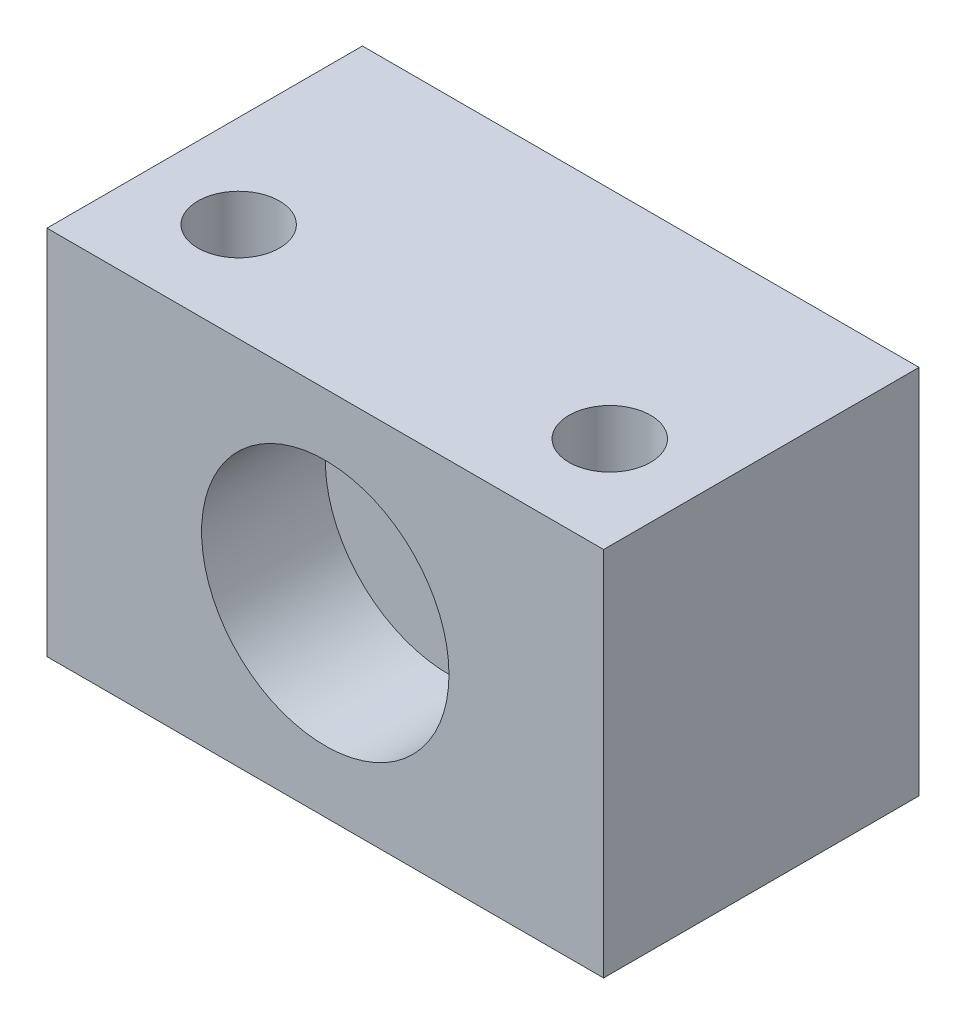
ISO-10303-21;
HEADER;
FILE_DESCRIPTION(('STEP AP214'),'2;1');
FILE_NAME('part.step','',(''),(''),'','','');
FILE_SCHEMA(('AUTOMOTIVE_DESIGN { 1 0 10303 214 1 1 1 1 }'));
ENDSEC;
DATA;
#1=APPLICATION_CONTEXT('core data for automotive mechanical design processes');
#2=APPLICATION_PROTOCOL_DEFINITION('international standard','automotive_design',2000,#1);
#3=PRODUCT_CONTEXT('',#1,'mechanical');
#4=PRODUCT('Part','Part','',(#3));
#5=PRODUCT_RELATED_PRODUCT_CATEGORY('part','',(#4));
#6=PRODUCT_DEFINITION_FORMATION('','',#4);
#7=PRODUCT_DEFINITION_CONTEXT('part definition',#1,'design');
#8=PRODUCT_DEFINITION('design','',#6,#7);
#9=PRODUCT_DEFINITION_SHAPE('','',#8);
#10=(LENGTH_UNIT() NAMED_UNIT(*) SI_UNIT(.MILLI.,.METRE.));
#11=(NAMED_UNIT(*) PLANE_ANGLE_UNIT() SI_UNIT($,.RADIAN.));
#12=(NAMED_UNIT(*) SI_UNIT($,.STERADIAN.) SOLID_ANGLE_UNIT());
#13=UNCERTAINTY_MEASURE_WITH_UNIT(LENGTH_MEASURE(1.E-05),#10,'distance_accuracy_value','');
#14=(GEOMETRIC_REPRESENTATION_CONTEXT(3) GLOBAL_UNCERTAINTY_ASSIGNED_CONTEXT((#13)) GLOBAL_UNIT_ASSIGNED_CONTEXT((#10,
#11,#12)) REPRESENTATION_CONTEXT('',''));
#15=CARTESIAN_POINT('',(0.,0.,0.));
#16=DIRECTION('',(0.,0.,1.));
#17=DIRECTION('',(1.,0.,0.));
#18=AXIS2_PLACEMENT_3D('',#15,#16,#17);
#19=CARTESIAN_POINT('',(0.,15.,0.));
#20=DIRECTION('',(0.,-1.,0.));
#21=DIRECTION('',(0.,0.,-1.));
#22=AXIS2_PLACEMENT_3D('',#19,#20,#21);
#23=PLANE('',#22);
#24=CARTESIAN_POINT('',(4.,15.,-4.));
#25=DIRECTION('',(0.,1.,0.));
#26=DIRECTION('',(0.,0.,1.));
#27=AXIS2_PLACEMENT_3D('',#24,#25,#26);
#28=CIRCLE('',#27,1.65);
#29=CARTESIAN_POINT('',(4.,15.,-2.35));
#30=VERTEX_POINT('',#29);
#31=EDGE_CURVE('E96',#30,#30,#28,.T.);
#32=ORIENTED_EDGE('',*,*,#31,.F.);
#33=EDGE_LOOP('',(#32));
#34=FACE_BOUND('',#33,.T.);
#35=CARTESIAN_POINT('',(19.,15.,-4.));
#36=DIRECTION('',(0.,1.,0.));
#37=DIRECTION('',(0.,0.,1.));
#38=AXIS2_PLACEMENT_3D('',#35,#36,#37);
#39=CIRCLE('',#38,1.65);
#40=CARTESIAN_POINT('',(19.,15.,-2.35));
#41=VERTEX_POINT('',#40);
#42=EDGE_CURVE('E104',#41,#41,#39,.T.);
#43=ORIENTED_EDGE('',*,*,#42,.F.);
#44=EDGE_LOOP('',(#43));
#45=FACE_BOUND('',#44,.T.);
#46=DIRECTION('',(0.,0.,1.));
#47=VECTOR('',#46,1.);
#48=CARTESIAN_POINT('',(0.25,15.,0.));
#49=LINE('',#48,#47);
#50=CARTESIAN_POINT('',(0.25,15.,-12.75));
#51=VERTEX_POINT('',#50);
#52=CARTESIAN_POINT('',(0.25,15.,0.));
#53=VERTEX_POINT('',#52);
#54=EDGE_CURVE('E51',#51,#53,#49,.T.);
#55=ORIENTED_EDGE('',*,*,#54,.T.);
#56=DIRECTION('',(1.,0.,0.));
#57=VECTOR('',#56,1.);
#58=CARTESIAN_POINT('',(0.,15.,0.));
#59=LINE('',#58,#57);
#60=CARTESIAN_POINT('',(22.75,15.,0.));
#61=VERTEX_POINT('',#60);
#62=EDGE_CURVE('E43',#53,#61,#59,.T.);
#63=ORIENTED_EDGE('',*,*,#62,.T.);
#64=DIRECTION('',(0.,0.,-1.));
#65=VECTOR('',#64,1.);
#66=CARTESIAN_POINT('',(22.75,15.,0.));
#67=LINE('',#66,#65);
#68=CARTESIAN_POINT('',(22.75,15.,-12.75));
#69=VERTEX_POINT('',#68);
#70=EDGE_CURVE('E84',#61,#69,#67,.T.);
#71=ORIENTED_EDGE('',*,*,#70,.T.);
#72=DIRECTION('',(-1.,0.,0.));
#73=VECTOR('',#72,1.);
#74=CARTESIAN_POINT('',(0.,15.,-12.75));
#75=LINE('',#74,#73);
#76=EDGE_CURVE('E12',#69,#51,#75,.T.);
#77=ORIENTED_EDGE('',*,*,#76,.T.);
#78=EDGE_LOOP('',(#55,#63,#71,#77));
#79=FACE_BOUND('',#78,.T.);
#80=ADVANCED_FACE('F34',(#34,#45,#79),#23,.F.);
#81=CARTESIAN_POINT('',(0.,0.,0.));
#82=DIRECTION('',(0.,-1.,0.));
#83=DIRECTION('',(0.,0.,-1.));
#84=AXIS2_PLACEMENT_3D('',#81,#82,#83);
#85=PLANE('',#84);
#86=CARTESIAN_POINT('',(4.,0.,-4.));
#87=DIRECTION('',(0.,1.,0.));
#88=DIRECTION('',(0.,0.,1.));
#89=AXIS2_PLACEMENT_3D('',#86,#87,#88);
#90=CIRCLE('',#89,1.65);
#91=CARTESIAN_POINT('',(4.,0.,-2.35));
#92=VERTEX_POINT('',#91);
#93=EDGE_CURVE('E99',#92,#92,#90,.T.);
#94=ORIENTED_EDGE('',*,*,#93,.T.);
#95=EDGE_LOOP('',(#94));
#96=FACE_BOUND('',#95,.T.);
#97=CARTESIAN_POINT('',(19.,0.,-4.));
#98=DIRECTION('',(0.,1.,0.));
#99=DIRECTION('',(0.,0.,1.));
#100=AXIS2_PLACEMENT_3D('',#97,#98,#99);
#101=CIRCLE('',#100,1.65);
#102=CARTESIAN_POINT('',(19.,0.,-2.35));
#103=VERTEX_POINT('',#102);
#104=EDGE_CURVE('E106',#103,#103,#101,.T.);
#105=ORIENTED_EDGE('',*,*,#104,.T.);
#106=EDGE_LOOP('',(#105));
#107=FACE_BOUND('',#106,.T.);
#108=DIRECTION('',(1.,0.,0.));
#109=VECTOR('',#108,1.);
#110=CARTESIAN_POINT('',(0.,0.,0.));
#111=LINE('',#110,#109);
#112=CARTESIAN_POINT('',(0.25,0.,0.));
#113=VERTEX_POINT('',#112);
#114=CARTESIAN_POINT('',(22.75,0.,0.));
#115=VERTEX_POINT('',#114);
#116=EDGE_CURVE('E90',#113,#115,#111,.T.);
#117=ORIENTED_EDGE('',*,*,#116,.F.);
#118=DIRECTION('',(0.,0.,1.));
#119=VECTOR('',#118,1.);
#120=CARTESIAN_POINT('',(0.25,0.,0.));
#121=LINE('',#120,#119);
#122=CARTESIAN_POINT('',(0.25,0.,-12.75));
#123=VERTEX_POINT('',#122);
#124=EDGE_CURVE('E75',#123,#113,#121,.T.);
#125=ORIENTED_EDGE('',*,*,#124,.F.);
#126=DIRECTION('',(-1.,0.,0.));
#127=VECTOR('',#126,1.);
#128=CARTESIAN_POINT('',(0.,0.,-12.75));
#129=LINE('',#128,#127);
#130=CARTESIAN_POINT('',(22.75,0.,-12.75));
#131=VERTEX_POINT('',#130);
#132=EDGE_CURVE('E95',#131,#123,#129,.T.);
#133=ORIENTED_EDGE('',*,*,#132,.F.);
#134=DIRECTION('',(0.,0.,-1.));
#135=VECTOR('',#134,1.);
#136=CARTESIAN_POINT('',(22.75,0.,0.));
#137=LINE('',#136,#135);
#138=EDGE_CURVE('E59',#115,#131,#137,.T.);
#139=ORIENTED_EDGE('',*,*,#138,.F.);
#140=EDGE_LOOP('',(#117,#125,#133,#139));
#141=FACE_BOUND('',#140,.T.);
#142=ADVANCED_FACE('F94',(#96,#107,#141),#85,.T.);
#143=CARTESIAN_POINT('',(0.,15.,0.));
#144=DIRECTION('',(0.,0.,-1.));
#145=DIRECTION('',(-1.,0.,0.));
#146=AXIS2_PLACEMENT_3D('',#143,#144,#145);
#147=PLANE('',#146);
#148=CARTESIAN_POINT('',(11.5,7.5,0.));
#149=DIRECTION('',(0.,0.,1.));
#150=DIRECTION('',(1.,0.,0.));
#151=AXIS2_PLACEMENT_3D('',#148,#149,#150);
#152=CIRCLE('',#151,5.);
#153=CARTESIAN_POINT('',(16.5,7.5,0.));
#154=VERTEX_POINT('',#153);
#155=EDGE_CURVE('E114',#154,#154,#152,.T.);
#156=ORIENTED_EDGE('',*,*,#155,.F.);
#157=EDGE_LOOP('',(#156));
#158=FACE_BOUND('',#157,.T.);
#159=DIRECTION('',(0.,1.,0.));
#160=VECTOR('',#159,1.);
#161=CARTESIAN_POINT('',(0.25,0.,0.));
#162=LINE('',#161,#160);
#163=EDGE_CURVE('E78',#113,#53,#162,.T.);
#164=ORIENTED_EDGE('',*,*,#163,.F.);
#165=ORIENTED_EDGE('',*,*,#116,.T.);
#166=DIRECTION('',(0.,1.,0.));
#167=VECTOR('',#166,1.);
#168=CARTESIAN_POINT('',(22.75,0.,0.));
#169=LINE('',#168,#167);
#170=EDGE_CURVE('E92',#115,#61,#169,.T.);
#171=ORIENTED_EDGE('',*,*,#170,.T.);
#172=ORIENTED_EDGE('',*,*,#62,.F.);
#173=EDGE_LOOP('',(#164,#165,#171,#172));
#174=FACE_BOUND('',#173,.T.);
#175=ADVANCED_FACE('F36',(#158,#174),#147,.F.);
#176=CARTESIAN_POINT('',(0.,15.,-12.75));
#177=DIRECTION('',(0.,0.,1.));
#178=DIRECTION('',(1.,0.,0.));
#179=AXIS2_PLACEMENT_3D('',#176,#177,#178);
#180=PLANE('',#179);
#181=CARTESIAN_POINT('',(11.5,7.5,-12.75));
#182=DIRECTION('',(0.,0.,1.));
#183=DIRECTION('',(1.,0.,0.));
#184=AXIS2_PLACEMENT_3D('',#181,#182,#183);
#185=CIRCLE('',#184,1.65);
#186=CARTESIAN_POINT('',(13.15,7.5,-12.75));
#187=VERTEX_POINT('',#186);
#188=EDGE_CURVE('E109',#187,#187,#185,.T.);
#189=ORIENTED_EDGE('',*,*,#188,.T.);
#190=EDGE_LOOP('',(#189));
#191=FACE_BOUND('',#190,.T.);
#192=DIRECTION('',(0.,1.,0.));
#193=VECTOR('',#192,1.);
#194=CARTESIAN_POINT('',(0.25,0.,-12.75));
#195=LINE('',#194,#193);
#196=EDGE_CURVE('E79',#123,#51,#195,.T.);
#197=ORIENTED_EDGE('',*,*,#196,.T.);
#198=ORIENTED_EDGE('',*,*,#76,.F.);
#199=DIRECTION('',(0.,1.,0.));
#200=VECTOR('',#199,1.);
#201=CARTESIAN_POINT('',(22.75,0.,-12.75));
#202=LINE('',#201,#200);
#203=EDGE_CURVE('E121',#131,#69,#202,.T.);
#204=ORIENTED_EDGE('',*,*,#203,.F.);
#205=ORIENTED_EDGE('',*,*,#132,.T.);
#206=EDGE_LOOP('',(#197,#198,#204,#205));
#207=FACE_BOUND('',#206,.T.);
#208=ADVANCED_FACE('F130',(#191,#207),#180,.F.);
#209=CARTESIAN_POINT('',(11.5,7.5,-12.75));
#210=DIRECTION('',(0.,0.,1.));
#211=DIRECTION('',(1.,0.,0.));
#212=AXIS2_PLACEMENT_3D('',#209,#210,#211);
#213=CYLINDRICAL_SURFACE('',#212,1.65);
#214=ORIENTED_EDGE('',*,*,#188,.F.);
#215=EDGE_LOOP('',(#214));
#216=FACE_BOUND('',#215,.T.);
#217=CARTESIAN_POINT('',(11.5,7.5,-5.));
#218=DIRECTION('',(0.,0.,1.));
#219=DIRECTION('',(1.,0.,0.));
#220=AXIS2_PLACEMENT_3D('',#217,#218,#219);
#221=CIRCLE('',#220,1.65);
#222=CARTESIAN_POINT('',(13.15,7.5,-5.));
#223=VERTEX_POINT('',#222);
#224=EDGE_CURVE('E38',#223,#223,#221,.F.);
#225=ORIENTED_EDGE('',*,*,#224,.F.);
#226=EDGE_LOOP('',(#225));
#227=FACE_BOUND('',#226,.T.);
#228=ADVANCED_FACE('F158',(#216,#227),#213,.F.);
#229=CARTESIAN_POINT('',(4.,15.,-4.));
#230=DIRECTION('',(0.,-1.,0.));
#231=DIRECTION('',(0.,0.,-1.));
#232=AXIS2_PLACEMENT_3D('',#229,#230,#231);
#233=CYLINDRICAL_SURFACE('',#232,1.65);
#234=ORIENTED_EDGE('',*,*,#31,.T.);
#235=EDGE_LOOP('',(#234));
#236=FACE_BOUND('',#235,.T.);
#237=ORIENTED_EDGE('',*,*,#93,.F.);
#238=EDGE_LOOP('',(#237));
#239=FACE_BOUND('',#238,.T.);
#240=ADVANCED_FACE('F155',(#236,#239),#233,.F.);
#241=CARTESIAN_POINT('',(19.,15.,-4.));
#242=DIRECTION('',(0.,-1.,0.));
#243=DIRECTION('',(0.,0.,-1.));
#244=AXIS2_PLACEMENT_3D('',#241,#242,#243);
#245=CYLINDRICAL_SURFACE('',#244,1.65);
#246=ORIENTED_EDGE('',*,*,#42,.T.);
#247=EDGE_LOOP('',(#246));
#248=FACE_BOUND('',#247,.T.);
#249=ORIENTED_EDGE('',*,*,#104,.F.);
#250=EDGE_LOOP('',(#249));
#251=FACE_BOUND('',#250,.T.);
#252=ADVANCED_FACE('F173',(#248,#251),#245,.F.);
#253=CARTESIAN_POINT('',(11.5,7.5,-5.));
#254=DIRECTION('',(0.,0.,1.));
#255=DIRECTION('',(1.,0.,0.));
#256=AXIS2_PLACEMENT_3D('',#253,#254,#255);
#257=PLANE('',#256);
#258=CARTESIAN_POINT('',(11.5,7.5,-5.));
#259=DIRECTION('',(0.,0.,1.));
#260=DIRECTION('',(1.,0.,0.));
#261=AXIS2_PLACEMENT_3D('',#258,#259,#260);
#262=CIRCLE('',#261,5.);
#263=CARTESIAN_POINT('',(16.5,7.5,-5.));
#264=VERTEX_POINT('',#263);
#265=EDGE_CURVE('E117',#264,#264,#262,.T.);
#266=ORIENTED_EDGE('',*,*,#265,.T.);
#267=EDGE_LOOP('',(#266));
#268=FACE_BOUND('',#267,.T.);
#269=ORIENTED_EDGE('',*,*,#224,.T.);
#270=EDGE_LOOP('',(#269));
#271=FACE_BOUND('',#270,.T.);
#272=ADVANCED_FACE('F141',(#268,#271),#257,.T.);
#273=CARTESIAN_POINT('',(11.5,7.5,-5.));
#274=DIRECTION('',(0.,0.,1.));
#275=DIRECTION('',(1.,0.,0.));
#276=AXIS2_PLACEMENT_3D('',#273,#274,#275);
#277=CYLINDRICAL_SURFACE('',#276,5.);
#278=ORIENTED_EDGE('',*,*,#265,.F.);
#279=EDGE_LOOP('',(#278));
#280=FACE_BOUND('',#279,.T.);
#281=ORIENTED_EDGE('',*,*,#155,.T.);
#282=EDGE_LOOP('',(#281));
#283=FACE_BOUND('',#282,.T.);
#284=ADVANCED_FACE('F133',(#280,#283),#277,.F.);
#285=CARTESIAN_POINT('',(22.75,0.,0.));
#286=DIRECTION('',(1.,0.,0.));
#287=DIRECTION('',(0.,0.,-1.));
#288=AXIS2_PLACEMENT_3D('',#285,#286,#287);
#289=PLANE('',#288);
#290=ORIENTED_EDGE('',*,*,#70,.F.);
#291=ORIENTED_EDGE('',*,*,#170,.F.);
#292=ORIENTED_EDGE('',*,*,#138,.T.);
#293=ORIENTED_EDGE('',*,*,#203,.T.);
#294=EDGE_LOOP('',(#290,#291,#292,#293));
#295=FACE_BOUND('',#294,.T.);
#296=ADVANCED_FACE('F131',(#295),#289,.T.);
#297=CARTESIAN_POINT('',(0.25,0.,0.));
#298=DIRECTION('',(-1.,0.,0.));
#299=DIRECTION('',(0.,0.,1.));
#300=AXIS2_PLACEMENT_3D('',#297,#298,#299);
#301=PLANE('',#300);
#302=ORIENTED_EDGE('',*,*,#54,.F.);
#303=ORIENTED_EDGE('',*,*,#196,.F.);
#304=ORIENTED_EDGE('',*,*,#124,.T.);
#305=ORIENTED_EDGE('',*,*,#163,.T.);
#306=EDGE_LOOP('',(#302,#303,#304,#305));
#307=FACE_BOUND('',#306,.T.);
#308=ADVANCED_FACE('F77',(#307),#301,.T.);
#309=CLOSED_SHELL('',(#80,#142,#175,#208,#228,#240,#252,#272,#284,#296,#308));
#310=MANIFOLD_SOLID_BREP('B2',#309);
#311=ADVANCED_BREP_SHAPE_REPRESENTATION('',(#18,#310),#14);
#312=SHAPE_DEFINITION_REPRESENTATION(#9,#311);
ENDSEC;
END-ISO-10303-21;
